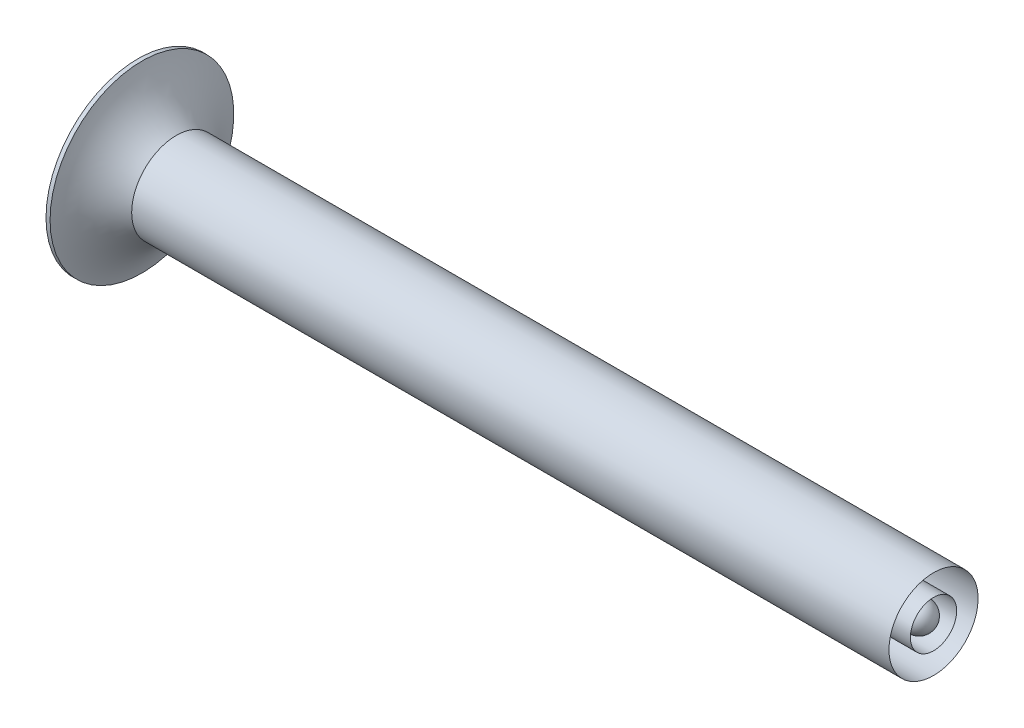
ISO-10303-21;
HEADER;
FILE_DESCRIPTION(('STEP AP214'),'2;1');
FILE_NAME('part.step','',(''),(''),'','','');
FILE_SCHEMA(('AUTOMOTIVE_DESIGN { 1 0 10303 214 1 1 1 1 }'));
ENDSEC;
DATA;
#1=APPLICATION_CONTEXT('core data for automotive mechanical design processes');
#2=APPLICATION_PROTOCOL_DEFINITION('international standard','automotive_design',2000,#1);
#3=PRODUCT_CONTEXT('',#1,'mechanical');
#4=PRODUCT('Part','Part','',(#3));
#5=PRODUCT_RELATED_PRODUCT_CATEGORY('part','',(#4));
#6=PRODUCT_DEFINITION_FORMATION('','',#4);
#7=PRODUCT_DEFINITION_CONTEXT('part definition',#1,'design');
#8=PRODUCT_DEFINITION('design','',#6,#7);
#9=PRODUCT_DEFINITION_SHAPE('','',#8);
#10=(LENGTH_UNIT() NAMED_UNIT(*) SI_UNIT(.MILLI.,.METRE.));
#11=(NAMED_UNIT(*) PLANE_ANGLE_UNIT() SI_UNIT($,.RADIAN.));
#12=(NAMED_UNIT(*) SI_UNIT($,.STERADIAN.) SOLID_ANGLE_UNIT());
#13=UNCERTAINTY_MEASURE_WITH_UNIT(LENGTH_MEASURE(1.E-05),#10,'distance_accuracy_value','');
#14=(GEOMETRIC_REPRESENTATION_CONTEXT(3) GLOBAL_UNCERTAINTY_ASSIGNED_CONTEXT((#13)) GLOBAL_UNIT_ASSIGNED_CONTEXT((#10,
#11,#12)) REPRESENTATION_CONTEXT('',''));
#15=CARTESIAN_POINT('',(0.,0.,0.));
#16=DIRECTION('',(0.,0.,1.));
#17=DIRECTION('',(1.,0.,0.));
#18=AXIS2_PLACEMENT_3D('',#15,#16,#17);
#19=CARTESIAN_POINT('',(0.,0.,0.));
#20=DIRECTION('',(1.,0.,0.));
#21=DIRECTION('',(0.,0.,-1.));
#22=AXIS2_PLACEMENT_3D('',#19,#20,#21);
#23=CYLINDRICAL_SURFACE('',#22,1.9558);
#24=CARTESIAN_POINT('',(0.,0.,0.));
#25=DIRECTION('',(-1.,0.,0.));
#26=DIRECTION('',(0.,0.,1.));
#27=AXIS2_PLACEMENT_3D('',#24,#25,#26);
#28=CIRCLE('',#27,1.9558);
#29=CARTESIAN_POINT('',(0.,0.,1.9558));
#30=VERTEX_POINT('',#29);
#31=EDGE_CURVE('E62',#30,#30,#28,.T.);
#32=ORIENTED_EDGE('',*,*,#31,.T.);
#33=EDGE_LOOP('',(#32));
#34=FACE_BOUND('',#33,.T.);
#35=CARTESIAN_POINT('',(34.925,0.,0.));
#36=DIRECTION('',(-1.,0.,0.));
#37=DIRECTION('',(0.,0.,1.));
#38=AXIS2_PLACEMENT_3D('',#35,#36,#37);
#39=CIRCLE('',#38,1.9558);
#40=CARTESIAN_POINT('',(34.925,0.,1.9558));
#41=VERTEX_POINT('',#40);
#42=EDGE_CURVE('E11',#41,#41,#39,.T.);
#43=ORIENTED_EDGE('',*,*,#42,.F.);
#44=EDGE_LOOP('',(#43));
#45=FACE_BOUND('',#44,.T.);
#46=ADVANCED_FACE('F58',(#34,#45),#23,.F.);
#47=OPEN_SHELL('',(#46));
#48=SHELL_BASED_SURFACE_MODEL('B2',(#47));
#49=CARTESIAN_POINT('',(0.,0.,0.));
#50=DIRECTION('',(1.,0.,0.));
#51=DIRECTION('',(0.,0.,-1.));
#52=AXIS2_PLACEMENT_3D('',#49,#50,#51);
#53=CYLINDRICAL_SURFACE('',#52,1.016);
#54=CARTESIAN_POINT('',(0.,0.,0.));
#55=DIRECTION('',(1.,0.,0.));
#56=DIRECTION('',(0.,0.,-1.));
#57=AXIS2_PLACEMENT_3D('',#54,#55,#56);
#58=CIRCLE('',#57,1.016);
#59=CARTESIAN_POINT('',(0.,0.,-1.016));
#60=VERTEX_POINT('',#59);
#61=EDGE_CURVE('E96',#60,#60,#58,.T.);
#62=ORIENTED_EDGE('',*,*,#61,.T.);
#63=EDGE_LOOP('',(#62));
#64=FACE_BOUND('',#63,.T.);
#65=CARTESIAN_POINT('',(34.925,0.,0.));
#66=DIRECTION('',(1.,0.,0.));
#67=DIRECTION('',(0.,0.,-1.));
#68=AXIS2_PLACEMENT_3D('',#65,#66,#67);
#69=CIRCLE('',#68,1.016);
#70=CARTESIAN_POINT('',(34.925,0.,-1.016));
#71=VERTEX_POINT('',#70);
#72=EDGE_CURVE('E57',#71,#71,#69,.T.);
#73=ORIENTED_EDGE('',*,*,#72,.F.);
#74=EDGE_LOOP('',(#73));
#75=FACE_BOUND('',#74,.T.);
#76=ADVANCED_FACE('F92',(#64,#75),#53,.T.);
#77=OPEN_SHELL('',(#76));
#78=SHELL_BASED_SURFACE_MODEL('B6',(#77));
#79=CARTESIAN_POINT('',(0.,0.,0.));
#80=DIRECTION('',(-1.,0.,0.));
#81=DIRECTION('',(0.,0.,1.));
#82=AXIS2_PLACEMENT_3D('',#79,#80,#81);
#83=CYLINDRICAL_SURFACE('',#82,4.03225);
#84=CARTESIAN_POINT('',(0.177800000000001,0.,0.));
#85=DIRECTION('',(-1.,0.,0.));
#86=DIRECTION('',(0.,0.,1.));
#87=AXIS2_PLACEMENT_3D('',#84,#85,#86);
#88=CIRCLE('',#87,4.03225);
#89=CARTESIAN_POINT('',(0.177800000000001,0.,4.03225));
#90=VERTEX_POINT('',#89);
#91=EDGE_CURVE('E150',#90,#90,#88,.T.);
#92=ORIENTED_EDGE('',*,*,#91,.T.);
#93=EDGE_LOOP('',(#92));
#94=FACE_BOUND('',#93,.T.);
#95=CARTESIAN_POINT('',(0.,0.,0.));
#96=DIRECTION('',(-1.,0.,0.));
#97=DIRECTION('',(0.,0.,1.));
#98=AXIS2_PLACEMENT_3D('',#95,#96,#97);
#99=CIRCLE('',#98,4.03225);
#100=CARTESIAN_POINT('',(0.,0.,4.03225));
#101=VERTEX_POINT('',#100);
#102=EDGE_CURVE('E91',#101,#101,#99,.T.);
#103=ORIENTED_EDGE('',*,*,#102,.F.);
#104=EDGE_LOOP('',(#103));
#105=FACE_BOUND('',#104,.T.);
#106=ADVANCED_FACE('F119',(#94,#105),#83,.T.);
#107=CARTESIAN_POINT('',(0.,-4.03225,0.));
#108=DIRECTION('',(-1.,0.,0.));
#109=DIRECTION('',(0.,0.,1.));
#110=AXIS2_PLACEMENT_3D('',#107,#108,#109);
#111=PLANE('',#110);
#112=ORIENTED_EDGE('',*,*,#102,.T.);
#113=EDGE_LOOP('',(#112));
#114=FACE_BOUND('',#113,.T.);
#115=ADVANCED_FACE('F169',(#114),#111,.T.);
#116=CARTESIAN_POINT('',(34.29,0.,0.));
#117=DIRECTION('',(-1.,0.,0.));
#118=DIRECTION('',(0.,-1.,0.));
#119=AXIS2_PLACEMENT_3D('',#116,#117,#118);
#120=SPHERICAL_SURFACE('',#119,0.634999999999999);
#121=CARTESIAN_POINT('',(34.3728841320597,0.,0.));
#122=DIRECTION('',(-1.,0.,0.));
#123=DIRECTION('',(0.,0.,1.));
#124=AXIS2_PLACEMENT_3D('',#121,#122,#123);
#125=CIRCLE('',#124,0.629567486972369);
#126=CARTESIAN_POINT('',(34.3728841320597,0.,0.629567486972369));
#127=VERTEX_POINT('',#126);
#128=EDGE_CURVE('E126',#127,#127,#125,.T.);
#129=ORIENTED_EDGE('',*,*,#128,.F.);
#130=EDGE_LOOP('',(#129));
#131=FACE_BOUND('',#130,.T.);
#132=ADVANCED_FACE('F173',(#131),#120,.T.);
#133=CARTESIAN_POINT('',(31.4376377819393,0.,0.));
#134=DIRECTION('',(-1.,0.,0.));
#135=DIRECTION('',(0.,0.,1.));
#136=AXIS2_PLACEMENT_3D('',#133,#134,#135);
#137=CONICAL_SURFACE('',#136,1.016,0.130899693899572);
#138=ORIENTED_EDGE('',*,*,#128,.T.);
#139=EDGE_LOOP('',(#138));
#140=FACE_BOUND('',#139,.T.);
#141=CARTESIAN_POINT('',(31.4376377819393,0.,0.));
#142=DIRECTION('',(-1.,0.,0.));
#143=DIRECTION('',(0.,0.,1.));
#144=AXIS2_PLACEMENT_3D('',#141,#142,#143);
#145=CIRCLE('',#144,1.016);
#146=CARTESIAN_POINT('',(31.4376377819393,0.,1.016));
#147=VERTEX_POINT('',#146);
#148=EDGE_CURVE('E131',#147,#147,#145,.T.);
#149=ORIENTED_EDGE('',*,*,#148,.F.);
#150=EDGE_LOOP('',(#149));
#151=FACE_BOUND('',#150,.T.);
#152=ADVANCED_FACE('F177',(#140,#151),#137,.T.);
#153=CARTESIAN_POINT('',(0.,0.,0.));
#154=DIRECTION('',(-1.,0.,0.));
#155=DIRECTION('',(0.,0.,1.));
#156=AXIS2_PLACEMENT_3D('',#153,#154,#155);
#157=CYLINDRICAL_SURFACE('',#156,1.016);
#158=ORIENTED_EDGE('',*,*,#148,.T.);
#159=EDGE_LOOP('',(#158));
#160=FACE_BOUND('',#159,.T.);
#161=CARTESIAN_POINT('',(13.9943215446322,0.,0.));
#162=DIRECTION('',(-1.,0.,0.));
#163=DIRECTION('',(0.,0.,1.));
#164=AXIS2_PLACEMENT_3D('',#161,#162,#163);
#165=CIRCLE('',#164,1.016);
#166=CARTESIAN_POINT('',(13.9943215446322,0.,1.016));
#167=VERTEX_POINT('',#166);
#168=EDGE_CURVE('E136',#167,#167,#165,.T.);
#169=ORIENTED_EDGE('',*,*,#168,.F.);
#170=EDGE_LOOP('',(#169));
#171=FACE_BOUND('',#170,.T.);
#172=ADVANCED_FACE('F183',(#160,#171),#157,.T.);
#173=CARTESIAN_POINT('',(12.065,0.,0.));
#174=DIRECTION('',(-1.,0.,0.));
#175=DIRECTION('',(0.,0.,1.));
#176=AXIS2_PLACEMENT_3D('',#173,#174,#175);
#177=CONICAL_SURFACE('',#176,1.27,0.130899693899576);
#178=ORIENTED_EDGE('',*,*,#168,.T.);
#179=EDGE_LOOP('',(#178));
#180=FACE_BOUND('',#179,.T.);
#181=CARTESIAN_POINT('',(12.065,0.,0.));
#182=DIRECTION('',(-1.,0.,0.));
#183=DIRECTION('',(0.,0.,1.));
#184=AXIS2_PLACEMENT_3D('',#181,#182,#183);
#185=CIRCLE('',#184,1.27);
#186=CARTESIAN_POINT('',(12.065,0.,1.27));
#187=VERTEX_POINT('',#186);
#188=EDGE_CURVE('E142',#187,#187,#185,.T.);
#189=ORIENTED_EDGE('',*,*,#188,.F.);
#190=EDGE_LOOP('',(#189));
#191=FACE_BOUND('',#190,.T.);
#192=ADVANCED_FACE('F165',(#180,#191),#177,.T.);
#193=CARTESIAN_POINT('',(0.,0.,0.));
#194=DIRECTION('',(-1.,0.,0.));
#195=DIRECTION('',(0.,0.,1.));
#196=AXIS2_PLACEMENT_3D('',#193,#194,#195);
#197=CYLINDRICAL_SURFACE('',#196,1.27);
#198=ORIENTED_EDGE('',*,*,#188,.T.);
#199=EDGE_LOOP('',(#198));
#200=FACE_BOUND('',#199,.T.);
#201=CARTESIAN_POINT('',(3.8608,0.,0.));
#202=DIRECTION('',(-1.,0.,0.));
#203=DIRECTION('',(0.,0.,1.));
#204=AXIS2_PLACEMENT_3D('',#201,#202,#203);
#205=CIRCLE('',#204,1.27);
#206=CARTESIAN_POINT('',(3.8608,0.,1.27));
#207=VERTEX_POINT('',#206);
#208=EDGE_CURVE('E146',#207,#207,#205,.T.);
#209=ORIENTED_EDGE('',*,*,#208,.F.);
#210=EDGE_LOOP('',(#209));
#211=FACE_BOUND('',#210,.T.);
#212=ADVANCED_FACE('F159',(#200,#211),#197,.T.);
#213=CARTESIAN_POINT('',(3.8608,0.,0.));
#214=DIRECTION('',(-1.,0.,0.));
#215=DIRECTION('',(0.,0.,1.));
#216=AXIS2_PLACEMENT_3D('',#213,#214,#215);
#217=TOROIDAL_SURFACE('',#216,5.10645833333333,3.83645833333333);
#218=ORIENTED_EDGE('',*,*,#208,.T.);
#219=EDGE_LOOP('',(#218));
#220=FACE_BOUND('',#219,.T.);
#221=ORIENTED_EDGE('',*,*,#91,.F.);
#222=EDGE_LOOP('',(#221));
#223=FACE_BOUND('',#222,.T.);
#224=ADVANCED_FACE('F157',(#220,#223),#217,.F.);
#225=CLOSED_SHELL('',(#106,#115,#132,#152,#172,#192,#212,#224));
#226=MANIFOLD_SOLID_BREP('B52',#225);
#227=ADVANCED_BREP_SHAPE_REPRESENTATION('',(#18,#226),#14);
#228=MANIFOLD_SURFACE_SHAPE_REPRESENTATION('',(#18,#48,#78),#14);
#229=SHAPE_REPRESENTATION('',(#18),#14);
#230=SHAPE_DEFINITION_REPRESENTATION(#9,#229);
#231=SHAPE_REPRESENTATION_RELATIONSHIP('','',#229,#227);
#232=SHAPE_REPRESENTATION_RELATIONSHIP('','',#229,#228);
ENDSEC;
END-ISO-10303-21;
